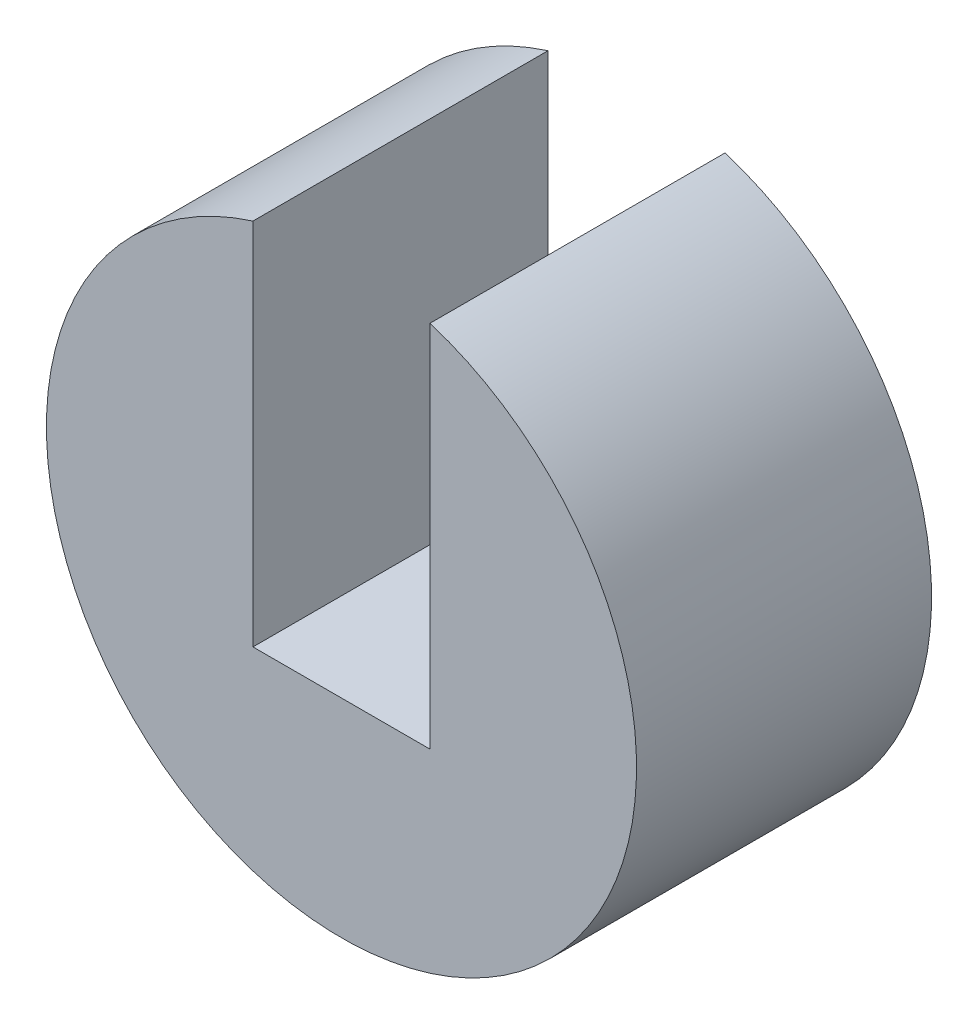
ISO-10303-21;
HEADER;
FILE_DESCRIPTION(('STEP AP214'),'2;1');
FILE_NAME('part.step','',(''),(''),'','','');
FILE_SCHEMA(('AUTOMOTIVE_DESIGN { 1 0 10303 214 1 1 1 1 }'));
ENDSEC;
DATA;
#1=APPLICATION_CONTEXT('core data for automotive mechanical design processes');
#2=APPLICATION_PROTOCOL_DEFINITION('international standard','automotive_design',2000,#1);
#3=PRODUCT_CONTEXT('',#1,'mechanical');
#4=PRODUCT('Part','Part','',(#3));
#5=PRODUCT_RELATED_PRODUCT_CATEGORY('part','',(#4));
#6=PRODUCT_DEFINITION_FORMATION('','',#4);
#7=PRODUCT_DEFINITION_CONTEXT('part definition',#1,'design');
#8=PRODUCT_DEFINITION('design','',#6,#7);
#9=PRODUCT_DEFINITION_SHAPE('','',#8);
#10=(LENGTH_UNIT() NAMED_UNIT(*) SI_UNIT(.MILLI.,.METRE.));
#11=(NAMED_UNIT(*) PLANE_ANGLE_UNIT() SI_UNIT($,.RADIAN.));
#12=(NAMED_UNIT(*) SI_UNIT($,.STERADIAN.) SOLID_ANGLE_UNIT());
#13=UNCERTAINTY_MEASURE_WITH_UNIT(LENGTH_MEASURE(1.E-05),#10,'distance_accuracy_value','');
#14=(GEOMETRIC_REPRESENTATION_CONTEXT(3) GLOBAL_UNCERTAINTY_ASSIGNED_CONTEXT((#13)) GLOBAL_UNIT_ASSIGNED_CONTEXT((#10,
#11,#12)) REPRESENTATION_CONTEXT('',''));
#15=CARTESIAN_POINT('',(0.,0.,0.));
#16=DIRECTION('',(0.,0.,1.));
#17=DIRECTION('',(1.,0.,0.));
#18=AXIS2_PLACEMENT_3D('',#15,#16,#17);
#19=CARTESIAN_POINT('',(-1.49999999999999,0.,5.));
#20=DIRECTION('',(-1.,0.,0.));
#21=DIRECTION('',(0.,0.,1.));
#22=AXIS2_PLACEMENT_3D('',#19,#20,#21);
#23=PLANE('',#22);
#24=DIRECTION('',(0.,1.,0.));
#25=VECTOR('',#24,1.);
#26=CARTESIAN_POINT('',(-1.49999999999999,0.,0.));
#27=LINE('',#26,#25);
#28=CARTESIAN_POINT('',(-1.49999999999999,-3.12500000000002,0.));
#29=VERTEX_POINT('',#28);
#30=CARTESIAN_POINT('',(-1.49999999999999,3.12499999999999,0.));
#31=VERTEX_POINT('',#30);
#32=EDGE_CURVE('E98',#29,#31,#27,.T.);
#33=ORIENTED_EDGE('',*,*,#32,.T.);
#34=DIRECTION('',(0.,0.,-1.));
#35=VECTOR('',#34,1.);
#36=CARTESIAN_POINT('',(-1.49999999999999,3.12499999999999,5.));
#37=LINE('',#36,#35);
#38=CARTESIAN_POINT('',(-1.49999999999999,3.12499999999999,5.));
#39=VERTEX_POINT('',#38);
#40=EDGE_CURVE('E11',#39,#31,#37,.T.);
#41=ORIENTED_EDGE('',*,*,#40,.F.);
#42=DIRECTION('',(0.,1.,0.));
#43=VECTOR('',#42,1.);
#44=CARTESIAN_POINT('',(-1.49999999999999,0.,5.));
#45=LINE('',#44,#43);
#46=CARTESIAN_POINT('',(-1.49999999999999,-3.12500000000002,5.));
#47=VERTEX_POINT('',#46);
#48=EDGE_CURVE('E83',#47,#39,#45,.T.);
#49=ORIENTED_EDGE('',*,*,#48,.F.);
#50=DIRECTION('',(0.,0.,-1.));
#51=VECTOR('',#50,1.);
#52=CARTESIAN_POINT('',(-1.49999999999999,-3.12500000000002,5.));
#53=LINE('',#52,#51);
#54=EDGE_CURVE('E94',#47,#29,#53,.T.);
#55=ORIENTED_EDGE('',*,*,#54,.T.);
#56=EDGE_LOOP('',(#33,#41,#49,#55));
#57=FACE_BOUND('',#56,.T.);
#58=ADVANCED_FACE('F36',(#57),#23,.F.);
#59=CARTESIAN_POINT('',(0.,-1.64469600708474,5.));
#60=DIRECTION('',(0.,0.,-1.));
#61=DIRECTION('',(-1.,0.,0.));
#62=AXIS2_PLACEMENT_3D('',#59,#60,#61);
#63=CYLINDRICAL_SURFACE('',#62,5.);
#64=CARTESIAN_POINT('',(0.,-1.64469600708474,0.));
#65=DIRECTION('',(0.,0.,1.));
#66=DIRECTION('',(1.,0.,0.));
#67=AXIS2_PLACEMENT_3D('',#64,#65,#66);
#68=CIRCLE('',#67,5.);
#69=CARTESIAN_POINT('',(1.50000000000001,3.12499999999999,0.));
#70=VERTEX_POINT('',#69);
#71=EDGE_CURVE('E88',#31,#70,#68,.T.);
#72=ORIENTED_EDGE('',*,*,#71,.T.);
#73=DIRECTION('',(0.,0.,-1.));
#74=VECTOR('',#73,1.);
#75=CARTESIAN_POINT('',(1.50000000000001,3.12499999999999,5.));
#76=LINE('',#75,#74);
#77=CARTESIAN_POINT('',(1.50000000000001,3.12499999999999,5.));
#78=VERTEX_POINT('',#77);
#79=EDGE_CURVE('E44',#78,#70,#76,.T.);
#80=ORIENTED_EDGE('',*,*,#79,.F.);
#81=CARTESIAN_POINT('',(0.,-1.64469600708474,5.));
#82=DIRECTION('',(0.,0.,1.));
#83=DIRECTION('',(1.,0.,0.));
#84=AXIS2_PLACEMENT_3D('',#81,#82,#83);
#85=CIRCLE('',#84,5.);
#86=EDGE_CURVE('E78',#39,#78,#85,.T.);
#87=ORIENTED_EDGE('',*,*,#86,.F.);
#88=ORIENTED_EDGE('',*,*,#40,.T.);
#89=EDGE_LOOP('',(#72,#80,#87,#88));
#90=FACE_BOUND('',#89,.T.);
#91=ADVANCED_FACE('F87',(#90),#63,.T.);
#92=CARTESIAN_POINT('',(1.50000000000002,0.,5.));
#93=DIRECTION('',(-1.,0.,0.));
#94=DIRECTION('',(0.,-1.,0.));
#95=AXIS2_PLACEMENT_3D('',#92,#93,#94);
#96=PLANE('',#95);
#97=DIRECTION('',(0.,1.,0.));
#98=VECTOR('',#97,1.);
#99=CARTESIAN_POINT('',(1.50000000000002,0.,0.));
#100=LINE('',#99,#98);
#101=CARTESIAN_POINT('',(1.50000000000002,-3.12500000000004,0.));
#102=VERTEX_POINT('',#101);
#103=EDGE_CURVE('E102',#102,#70,#100,.T.);
#104=ORIENTED_EDGE('',*,*,#103,.F.);
#105=DIRECTION('',(0.,0.,-1.));
#106=VECTOR('',#105,1.);
#107=CARTESIAN_POINT('',(1.50000000000002,-3.12500000000004,5.));
#108=LINE('',#107,#106);
#109=CARTESIAN_POINT('',(1.50000000000002,-3.12500000000004,5.));
#110=VERTEX_POINT('',#109);
#111=EDGE_CURVE('E68',#110,#102,#108,.T.);
#112=ORIENTED_EDGE('',*,*,#111,.F.);
#113=DIRECTION('',(0.,1.,0.));
#114=VECTOR('',#113,1.);
#115=CARTESIAN_POINT('',(1.50000000000002,0.,5.));
#116=LINE('',#115,#114);
#117=EDGE_CURVE('E81',#110,#78,#116,.T.);
#118=ORIENTED_EDGE('',*,*,#117,.T.);
#119=ORIENTED_EDGE('',*,*,#79,.T.);
#120=EDGE_LOOP('',(#104,#112,#118,#119));
#121=FACE_BOUND('',#120,.T.);
#122=ADVANCED_FACE('F92',(#121),#96,.T.);
#123=CARTESIAN_POINT('',(0.,-3.12500000000003,5.));
#124=DIRECTION('',(0.,-1.,0.));
#125=DIRECTION('',(1.,0.,0.));
#126=AXIS2_PLACEMENT_3D('',#123,#124,#125);
#127=PLANE('',#126);
#128=DIRECTION('',(-1.,0.,0.));
#129=VECTOR('',#128,1.);
#130=CARTESIAN_POINT('',(0.,-3.12500000000003,0.));
#131=LINE('',#130,#129);
#132=EDGE_CURVE('E71',#102,#29,#131,.T.);
#133=ORIENTED_EDGE('',*,*,#132,.T.);
#134=ORIENTED_EDGE('',*,*,#54,.F.);
#135=DIRECTION('',(-1.,0.,0.));
#136=VECTOR('',#135,1.);
#137=CARTESIAN_POINT('',(0.,-3.12500000000003,5.));
#138=LINE('',#137,#136);
#139=EDGE_CURVE('E52',#110,#47,#138,.T.);
#140=ORIENTED_EDGE('',*,*,#139,.F.);
#141=ORIENTED_EDGE('',*,*,#111,.T.);
#142=EDGE_LOOP('',(#133,#134,#140,#141));
#143=FACE_BOUND('',#142,.T.);
#144=ADVANCED_FACE('F115',(#143),#127,.F.);
#145=CARTESIAN_POINT('',(0.,0.,5.));
#146=DIRECTION('',(0.,0.,1.));
#147=DIRECTION('',(1.,0.,0.));
#148=AXIS2_PLACEMENT_3D('',#145,#146,#147);
#149=PLANE('',#148);
#150=ORIENTED_EDGE('',*,*,#48,.T.);
#151=ORIENTED_EDGE('',*,*,#86,.T.);
#152=ORIENTED_EDGE('',*,*,#117,.F.);
#153=ORIENTED_EDGE('',*,*,#139,.T.);
#154=EDGE_LOOP('',(#150,#151,#152,#153));
#155=FACE_BOUND('',#154,.T.);
#156=ADVANCED_FACE('F79',(#155),#149,.T.);
#157=CARTESIAN_POINT('',(0.,0.,0.));
#158=DIRECTION('',(0.,0.,1.));
#159=DIRECTION('',(1.,0.,0.));
#160=AXIS2_PLACEMENT_3D('',#157,#158,#159);
#161=PLANE('',#160);
#162=ORIENTED_EDGE('',*,*,#32,.F.);
#163=ORIENTED_EDGE('',*,*,#132,.F.);
#164=ORIENTED_EDGE('',*,*,#103,.T.);
#165=ORIENTED_EDGE('',*,*,#71,.F.);
#166=EDGE_LOOP('',(#162,#163,#164,#165));
#167=FACE_BOUND('',#166,.T.);
#168=ADVANCED_FACE('F109',(#167),#161,.F.);
#169=CLOSED_SHELL('',(#58,#91,#122,#144,#156,#168));
#170=MANIFOLD_SOLID_BREP('B2',#169);
#171=ADVANCED_BREP_SHAPE_REPRESENTATION('',(#18,#170),#14);
#172=SHAPE_DEFINITION_REPRESENTATION(#9,#171);
ENDSEC;
END-ISO-10303-21;
